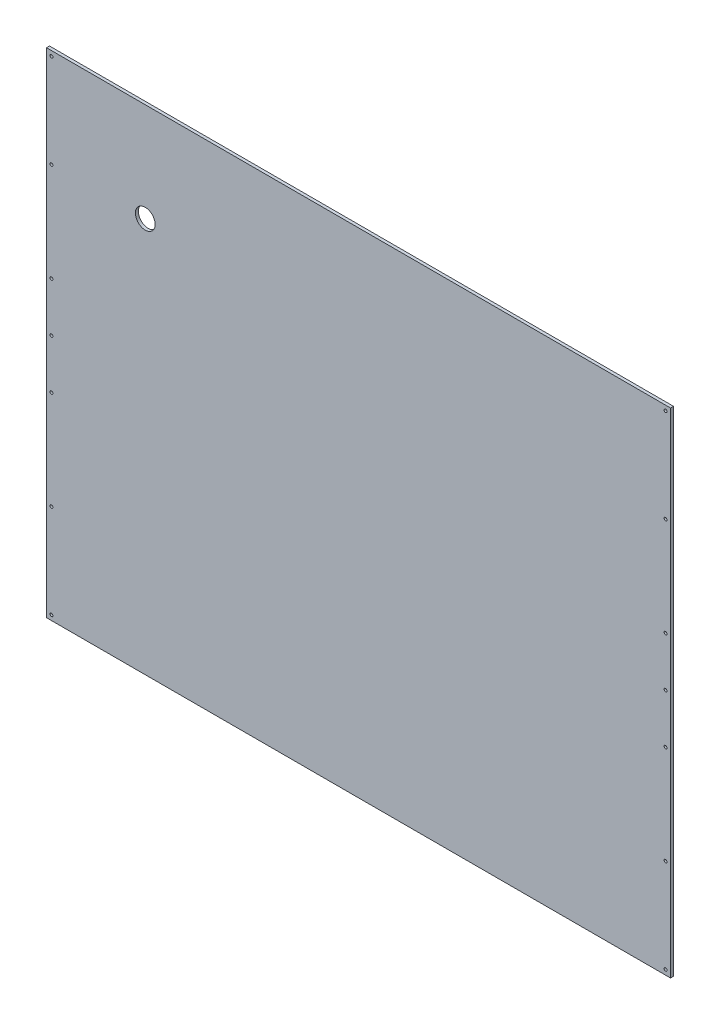
ISO-10303-21;
HEADER;
FILE_DESCRIPTION(('STEP AP214'),'2;1');
FILE_NAME('part.step','',(''),(''),'','','');
FILE_SCHEMA(('AUTOMOTIVE_DESIGN { 1 0 10303 214 1 1 1 1 }'));
ENDSEC;
DATA;
#1=APPLICATION_CONTEXT('core data for automotive mechanical design processes');
#2=APPLICATION_PROTOCOL_DEFINITION('international standard','automotive_design',2000,#1);
#3=PRODUCT_CONTEXT('',#1,'mechanical');
#4=PRODUCT('Part','Part','',(#3));
#5=PRODUCT_RELATED_PRODUCT_CATEGORY('part','',(#4));
#6=PRODUCT_DEFINITION_FORMATION('','',#4);
#7=PRODUCT_DEFINITION_CONTEXT('part definition',#1,'design');
#8=PRODUCT_DEFINITION('design','',#6,#7);
#9=PRODUCT_DEFINITION_SHAPE('','',#8);
#10=(LENGTH_UNIT() NAMED_UNIT(*) SI_UNIT(.MILLI.,.METRE.));
#11=(NAMED_UNIT(*) PLANE_ANGLE_UNIT() SI_UNIT($,.RADIAN.));
#12=(NAMED_UNIT(*) SI_UNIT($,.STERADIAN.) SOLID_ANGLE_UNIT());
#13=UNCERTAINTY_MEASURE_WITH_UNIT(LENGTH_MEASURE(1.E-05),#10,'distance_accuracy_value','');
#14=(GEOMETRIC_REPRESENTATION_CONTEXT(3) GLOBAL_UNCERTAINTY_ASSIGNED_CONTEXT((#13)) GLOBAL_UNIT_ASSIGNED_CONTEXT((#10,
#11,#12)) REPRESENTATION_CONTEXT('',''));
#15=CARTESIAN_POINT('',(0.,0.,0.));
#16=DIRECTION('',(0.,0.,1.));
#17=DIRECTION('',(1.,0.,0.));
#18=AXIS2_PLACEMENT_3D('',#15,#16,#17);
#19=CARTESIAN_POINT('',(0.,0.,3.));
#20=DIRECTION('',(0.,0.,-1.));
#21=DIRECTION('',(-1.,0.,0.));
#22=AXIS2_PLACEMENT_3D('',#19,#20,#21);
#23=PLANE('',#22);
#24=DIRECTION('',(0.,-1.,0.));
#25=VECTOR('',#24,1.);
#26=CARTESIAN_POINT('',(0.,0.,3.));
#27=LINE('',#26,#25);
#28=CARTESIAN_POINT('',(0.,500.,3.));
#29=VERTEX_POINT('',#28);
#30=CARTESIAN_POINT('',(0.,0.,3.));
#31=VERTEX_POINT('',#30);
#32=EDGE_CURVE('E87',#29,#31,#27,.T.);
#33=ORIENTED_EDGE('',*,*,#32,.T.);
#34=DIRECTION('',(1.,0.,0.));
#35=VECTOR('',#34,1.);
#36=CARTESIAN_POINT('',(0.,0.,3.));
#37=LINE('',#36,#35);
#38=CARTESIAN_POINT('',(632.,0.,3.));
#39=VERTEX_POINT('',#38);
#40=EDGE_CURVE('E82',#31,#39,#37,.T.);
#41=ORIENTED_EDGE('',*,*,#40,.T.);
#42=DIRECTION('',(0.,1.,0.));
#43=VECTOR('',#42,1.);
#44=CARTESIAN_POINT('',(632.,0.,3.));
#45=LINE('',#44,#43);
#46=CARTESIAN_POINT('',(632.,500.,3.));
#47=VERTEX_POINT('',#46);
#48=EDGE_CURVE('E85',#39,#47,#45,.T.);
#49=ORIENTED_EDGE('',*,*,#48,.T.);
#50=DIRECTION('',(-1.,0.,0.));
#51=VECTOR('',#50,1.);
#52=CARTESIAN_POINT('',(0.,500.,3.));
#53=LINE('',#52,#51);
#54=EDGE_CURVE('E52',#47,#29,#53,.T.);
#55=ORIENTED_EDGE('',*,*,#54,.T.);
#56=EDGE_LOOP('',(#33,#41,#49,#55));
#57=FACE_BOUND('',#56,.T.);
#58=CARTESIAN_POINT('',(627.,250.,3.));
#59=DIRECTION('',(0.,0.,1.));
#60=DIRECTION('',(1.,0.,0.));
#61=AXIS2_PLACEMENT_3D('',#58,#59,#60);
#62=CIRCLE('',#61,1.49999999999997);
#63=CARTESIAN_POINT('',(628.5,250.,3.));
#64=VERTEX_POINT('',#63);
#65=EDGE_CURVE('E102',#64,#64,#62,.T.);
#66=ORIENTED_EDGE('',*,*,#65,.F.);
#67=EDGE_LOOP('',(#66));
#68=FACE_BOUND('',#67,.T.);
#69=CARTESIAN_POINT('',(627.,300.,3.));
#70=DIRECTION('',(0.,0.,1.));
#71=DIRECTION('',(1.,0.,0.));
#72=AXIS2_PLACEMENT_3D('',#69,#70,#71);
#73=CIRCLE('',#72,1.49999999999997);
#74=CARTESIAN_POINT('',(628.5,300.,3.));
#75=VERTEX_POINT('',#74);
#76=EDGE_CURVE('E117',#75,#75,#73,.T.);
#77=ORIENTED_EDGE('',*,*,#76,.F.);
#78=EDGE_LOOP('',(#77));
#79=FACE_BOUND('',#78,.T.);
#80=CARTESIAN_POINT('',(627.,4.99999999999995,3.));
#81=DIRECTION('',(0.,0.,1.));
#82=DIRECTION('',(-1.,0.,0.));
#83=AXIS2_PLACEMENT_3D('',#80,#81,#82);
#84=CIRCLE('',#83,1.49999999999997);
#85=CARTESIAN_POINT('',(625.5,4.99999999999995,3.));
#86=VERTEX_POINT('',#85);
#87=EDGE_CURVE('E123',#86,#86,#84,.T.);
#88=ORIENTED_EDGE('',*,*,#87,.F.);
#89=EDGE_LOOP('',(#88));
#90=FACE_BOUND('',#89,.T.);
#91=CARTESIAN_POINT('',(627.,400.,3.));
#92=DIRECTION('',(0.,0.,1.));
#93=DIRECTION('',(1.,0.,0.));
#94=AXIS2_PLACEMENT_3D('',#91,#92,#93);
#95=CIRCLE('',#94,1.49999999999997);
#96=CARTESIAN_POINT('',(628.5,400.,3.));
#97=VERTEX_POINT('',#96);
#98=EDGE_CURVE('E129',#97,#97,#95,.T.);
#99=ORIENTED_EDGE('',*,*,#98,.F.);
#100=EDGE_LOOP('',(#99));
#101=FACE_BOUND('',#100,.T.);
#102=CARTESIAN_POINT('',(627.,99.9999999999999,3.));
#103=DIRECTION('',(0.,0.,1.));
#104=DIRECTION('',(-1.,0.,0.));
#105=AXIS2_PLACEMENT_3D('',#102,#103,#104);
#106=CIRCLE('',#105,1.49999999999997);
#107=CARTESIAN_POINT('',(625.5,99.9999999999999,3.));
#108=VERTEX_POINT('',#107);
#109=EDGE_CURVE('E135',#108,#108,#106,.T.);
#110=ORIENTED_EDGE('',*,*,#109,.F.);
#111=EDGE_LOOP('',(#110));
#112=FACE_BOUND('',#111,.T.);
#113=CARTESIAN_POINT('',(627.,495.,3.));
#114=DIRECTION('',(0.,0.,1.));
#115=DIRECTION('',(1.,0.,0.));
#116=AXIS2_PLACEMENT_3D('',#113,#114,#115);
#117=CIRCLE('',#116,1.49999999999997);
#118=CARTESIAN_POINT('',(628.5,495.,3.));
#119=VERTEX_POINT('',#118);
#120=EDGE_CURVE('E141',#119,#119,#117,.T.);
#121=ORIENTED_EDGE('',*,*,#120,.F.);
#122=EDGE_LOOP('',(#121));
#123=FACE_BOUND('',#122,.T.);
#124=CARTESIAN_POINT('',(627.,200.,3.));
#125=DIRECTION('',(0.,0.,1.));
#126=DIRECTION('',(-1.,0.,0.));
#127=AXIS2_PLACEMENT_3D('',#124,#125,#126);
#128=CIRCLE('',#127,1.49999999999997);
#129=CARTESIAN_POINT('',(625.5,200.,3.));
#130=VERTEX_POINT('',#129);
#131=EDGE_CURVE('E147',#130,#130,#128,.T.);
#132=ORIENTED_EDGE('',*,*,#131,.F.);
#133=EDGE_LOOP('',(#132));
#134=FACE_BOUND('',#133,.T.);
#135=CARTESIAN_POINT('',(5.,200.,3.));
#136=DIRECTION('',(0.,0.,1.));
#137=DIRECTION('',(1.,0.,0.));
#138=AXIS2_PLACEMENT_3D('',#135,#136,#137);
#139=CIRCLE('',#138,1.49999999999997);
#140=CARTESIAN_POINT('',(6.49999999999998,200.,3.));
#141=VERTEX_POINT('',#140);
#142=EDGE_CURVE('E153',#141,#141,#139,.T.);
#143=ORIENTED_EDGE('',*,*,#142,.F.);
#144=EDGE_LOOP('',(#143));
#145=FACE_BOUND('',#144,.T.);
#146=CARTESIAN_POINT('',(5.,99.9999999999999,3.));
#147=DIRECTION('',(0.,0.,1.));
#148=DIRECTION('',(1.,0.,0.));
#149=AXIS2_PLACEMENT_3D('',#146,#147,#148);
#150=CIRCLE('',#149,1.49999999999997);
#151=CARTESIAN_POINT('',(6.49999999999998,99.9999999999999,3.));
#152=VERTEX_POINT('',#151);
#153=EDGE_CURVE('E159',#152,#152,#150,.T.);
#154=ORIENTED_EDGE('',*,*,#153,.F.);
#155=EDGE_LOOP('',(#154));
#156=FACE_BOUND('',#155,.T.);
#157=CARTESIAN_POINT('',(4.99999999999989,4.99999999999995,3.));
#158=DIRECTION('',(0.,0.,1.));
#159=DIRECTION('',(1.,0.,0.));
#160=AXIS2_PLACEMENT_3D('',#157,#158,#159);
#161=CIRCLE('',#160,1.49999999999997);
#162=CARTESIAN_POINT('',(6.49999999999986,4.99999999999995,3.));
#163=VERTEX_POINT('',#162);
#164=EDGE_CURVE('E165',#163,#163,#161,.T.);
#165=ORIENTED_EDGE('',*,*,#164,.F.);
#166=EDGE_LOOP('',(#165));
#167=FACE_BOUND('',#166,.T.);
#168=CARTESIAN_POINT('',(5.,495.,3.));
#169=DIRECTION('',(0.,0.,1.));
#170=DIRECTION('',(-1.,0.,0.));
#171=AXIS2_PLACEMENT_3D('',#168,#169,#170);
#172=CIRCLE('',#171,1.49999999999997);
#173=CARTESIAN_POINT('',(3.50000000000003,495.,3.));
#174=VERTEX_POINT('',#173);
#175=EDGE_CURVE('E171',#174,#174,#172,.T.);
#176=ORIENTED_EDGE('',*,*,#175,.F.);
#177=EDGE_LOOP('',(#176));
#178=FACE_BOUND('',#177,.T.);
#179=CARTESIAN_POINT('',(5.,400.,3.));
#180=DIRECTION('',(0.,0.,1.));
#181=DIRECTION('',(-1.,0.,0.));
#182=AXIS2_PLACEMENT_3D('',#179,#180,#181);
#183=CIRCLE('',#182,1.49999999999997);
#184=CARTESIAN_POINT('',(3.50000000000003,400.,3.));
#185=VERTEX_POINT('',#184);
#186=EDGE_CURVE('E177',#185,#185,#183,.T.);
#187=ORIENTED_EDGE('',*,*,#186,.F.);
#188=EDGE_LOOP('',(#187));
#189=FACE_BOUND('',#188,.T.);
#190=CARTESIAN_POINT('',(5.,300.,3.));
#191=DIRECTION('',(0.,0.,1.));
#192=DIRECTION('',(-1.,0.,0.));
#193=AXIS2_PLACEMENT_3D('',#190,#191,#192);
#194=CIRCLE('',#193,1.49999999999997);
#195=CARTESIAN_POINT('',(3.50000000000003,300.,3.));
#196=VERTEX_POINT('',#195);
#197=EDGE_CURVE('E183',#196,#196,#194,.T.);
#198=ORIENTED_EDGE('',*,*,#197,.F.);
#199=EDGE_LOOP('',(#198));
#200=FACE_BOUND('',#199,.T.);
#201=CARTESIAN_POINT('',(5.,250.,3.));
#202=DIRECTION('',(0.,0.,1.));
#203=DIRECTION('',(-1.,0.,0.));
#204=AXIS2_PLACEMENT_3D('',#201,#202,#203);
#205=CIRCLE('',#204,1.49999999999997);
#206=CARTESIAN_POINT('',(3.50000000000003,250.,3.));
#207=VERTEX_POINT('',#206);
#208=EDGE_CURVE('E189',#207,#207,#205,.T.);
#209=ORIENTED_EDGE('',*,*,#208,.F.);
#210=EDGE_LOOP('',(#209));
#211=FACE_BOUND('',#210,.T.);
#212=CARTESIAN_POINT('',(100.,400.,3.));
#213=DIRECTION('',(0.,0.,1.));
#214=DIRECTION('',(1.,0.,0.));
#215=AXIS2_PLACEMENT_3D('',#212,#213,#214);
#216=CIRCLE('',#215,10.);
#217=CARTESIAN_POINT('',(110.,400.,3.));
#218=VERTEX_POINT('',#217);
#219=EDGE_CURVE('E195',#218,#218,#216,.T.);
#220=ORIENTED_EDGE('',*,*,#219,.F.);
#221=EDGE_LOOP('',(#220));
#222=FACE_BOUND('',#221,.T.);
#223=ADVANCED_FACE('F35',(#57,#68,#79,#90,#101,#112,#123,#134,#145,#156,#167,#178,#189,#200,
#211,#222),#23,.F.);
#224=CARTESIAN_POINT('',(0.,0.,0.));
#225=DIRECTION('',(0.,0.,-1.));
#226=DIRECTION('',(-1.,0.,0.));
#227=AXIS2_PLACEMENT_3D('',#224,#225,#226);
#228=PLANE('',#227);
#229=CARTESIAN_POINT('',(5.,250.,0.));
#230=DIRECTION('',(0.,0.,1.));
#231=DIRECTION('',(-1.,0.,0.));
#232=AXIS2_PLACEMENT_3D('',#229,#230,#231);
#233=CIRCLE('',#232,1.49999999999997);
#234=CARTESIAN_POINT('',(3.50000000000003,250.,0.));
#235=VERTEX_POINT('',#234);
#236=EDGE_CURVE('E192',#235,#235,#233,.T.);
#237=ORIENTED_EDGE('',*,*,#236,.T.);
#238=EDGE_LOOP('',(#237));
#239=FACE_BOUND('',#238,.T.);
#240=CARTESIAN_POINT('',(5.,400.,0.));
#241=DIRECTION('',(0.,0.,1.));
#242=DIRECTION('',(-1.,0.,0.));
#243=AXIS2_PLACEMENT_3D('',#240,#241,#242);
#244=CIRCLE('',#243,1.49999999999997);
#245=CARTESIAN_POINT('',(3.50000000000003,400.,0.));
#246=VERTEX_POINT('',#245);
#247=EDGE_CURVE('E180',#246,#246,#244,.T.);
#248=ORIENTED_EDGE('',*,*,#247,.T.);
#249=EDGE_LOOP('',(#248));
#250=FACE_BOUND('',#249,.T.);
#251=CARTESIAN_POINT('',(4.99999999999989,4.99999999999995,0.));
#252=DIRECTION('',(0.,0.,1.));
#253=DIRECTION('',(1.,0.,0.));
#254=AXIS2_PLACEMENT_3D('',#251,#252,#253);
#255=CIRCLE('',#254,1.49999999999997);
#256=CARTESIAN_POINT('',(6.49999999999986,4.99999999999995,0.));
#257=VERTEX_POINT('',#256);
#258=EDGE_CURVE('E168',#257,#257,#255,.T.);
#259=ORIENTED_EDGE('',*,*,#258,.T.);
#260=EDGE_LOOP('',(#259));
#261=FACE_BOUND('',#260,.T.);
#262=CARTESIAN_POINT('',(5.,200.,0.));
#263=DIRECTION('',(0.,0.,1.));
#264=DIRECTION('',(1.,0.,0.));
#265=AXIS2_PLACEMENT_3D('',#262,#263,#264);
#266=CIRCLE('',#265,1.49999999999997);
#267=CARTESIAN_POINT('',(6.49999999999998,200.,0.));
#268=VERTEX_POINT('',#267);
#269=EDGE_CURVE('E156',#268,#268,#266,.T.);
#270=ORIENTED_EDGE('',*,*,#269,.T.);
#271=EDGE_LOOP('',(#270));
#272=FACE_BOUND('',#271,.T.);
#273=CARTESIAN_POINT('',(627.,495.,0.));
#274=DIRECTION('',(0.,0.,1.));
#275=DIRECTION('',(1.,0.,0.));
#276=AXIS2_PLACEMENT_3D('',#273,#274,#275);
#277=CIRCLE('',#276,1.49999999999997);
#278=CARTESIAN_POINT('',(628.5,495.,0.));
#279=VERTEX_POINT('',#278);
#280=EDGE_CURVE('E144',#279,#279,#277,.T.);
#281=ORIENTED_EDGE('',*,*,#280,.T.);
#282=EDGE_LOOP('',(#281));
#283=FACE_BOUND('',#282,.T.);
#284=CARTESIAN_POINT('',(627.,400.,0.));
#285=DIRECTION('',(0.,0.,1.));
#286=DIRECTION('',(1.,0.,0.));
#287=AXIS2_PLACEMENT_3D('',#284,#285,#286);
#288=CIRCLE('',#287,1.49999999999997);
#289=CARTESIAN_POINT('',(628.5,400.,0.));
#290=VERTEX_POINT('',#289);
#291=EDGE_CURVE('E132',#290,#290,#288,.T.);
#292=ORIENTED_EDGE('',*,*,#291,.T.);
#293=EDGE_LOOP('',(#292));
#294=FACE_BOUND('',#293,.T.);
#295=CARTESIAN_POINT('',(627.,300.,0.));
#296=DIRECTION('',(0.,0.,1.));
#297=DIRECTION('',(1.,0.,0.));
#298=AXIS2_PLACEMENT_3D('',#295,#296,#297);
#299=CIRCLE('',#298,1.49999999999997);
#300=CARTESIAN_POINT('',(628.5,300.,0.));
#301=VERTEX_POINT('',#300);
#302=EDGE_CURVE('E120',#301,#301,#299,.T.);
#303=ORIENTED_EDGE('',*,*,#302,.T.);
#304=EDGE_LOOP('',(#303));
#305=FACE_BOUND('',#304,.T.);
#306=DIRECTION('',(0.,-1.,0.));
#307=VECTOR('',#306,1.);
#308=CARTESIAN_POINT('',(0.,0.,0.));
#309=LINE('',#308,#307);
#310=CARTESIAN_POINT('',(0.,500.,0.));
#311=VERTEX_POINT('',#310);
#312=CARTESIAN_POINT('',(0.,0.,0.));
#313=VERTEX_POINT('',#312);
#314=EDGE_CURVE('E99',#311,#313,#309,.T.);
#315=ORIENTED_EDGE('',*,*,#314,.F.);
#316=DIRECTION('',(-1.,0.,0.));
#317=VECTOR('',#316,1.);
#318=CARTESIAN_POINT('',(0.,500.,0.));
#319=LINE('',#318,#317);
#320=CARTESIAN_POINT('',(632.,500.,0.));
#321=VERTEX_POINT('',#320);
#322=EDGE_CURVE('E75',#321,#311,#319,.T.);
#323=ORIENTED_EDGE('',*,*,#322,.F.);
#324=DIRECTION('',(0.,1.,0.));
#325=VECTOR('',#324,1.);
#326=CARTESIAN_POINT('',(632.,0.,0.));
#327=LINE('',#326,#325);
#328=CARTESIAN_POINT('',(632.,0.,0.));
#329=VERTEX_POINT('',#328);
#330=EDGE_CURVE('E69',#329,#321,#327,.T.);
#331=ORIENTED_EDGE('',*,*,#330,.F.);
#332=DIRECTION('',(1.,0.,0.));
#333=VECTOR('',#332,1.);
#334=CARTESIAN_POINT('',(0.,0.,0.));
#335=LINE('',#334,#333);
#336=EDGE_CURVE('E91',#313,#329,#335,.T.);
#337=ORIENTED_EDGE('',*,*,#336,.F.);
#338=EDGE_LOOP('',(#315,#323,#331,#337));
#339=FACE_BOUND('',#338,.T.);
#340=CARTESIAN_POINT('',(627.,250.,0.));
#341=DIRECTION('',(0.,0.,1.));
#342=DIRECTION('',(1.,0.,0.));
#343=AXIS2_PLACEMENT_3D('',#340,#341,#342);
#344=CIRCLE('',#343,1.49999999999997);
#345=CARTESIAN_POINT('',(628.5,250.,0.));
#346=VERTEX_POINT('',#345);
#347=EDGE_CURVE('E114',#346,#346,#344,.T.);
#348=ORIENTED_EDGE('',*,*,#347,.T.);
#349=EDGE_LOOP('',(#348));
#350=FACE_BOUND('',#349,.T.);
#351=CARTESIAN_POINT('',(627.,4.99999999999995,0.));
#352=DIRECTION('',(0.,0.,1.));
#353=DIRECTION('',(-1.,0.,0.));
#354=AXIS2_PLACEMENT_3D('',#351,#352,#353);
#355=CIRCLE('',#354,1.49999999999997);
#356=CARTESIAN_POINT('',(625.5,4.99999999999995,0.));
#357=VERTEX_POINT('',#356);
#358=EDGE_CURVE('E126',#357,#357,#355,.T.);
#359=ORIENTED_EDGE('',*,*,#358,.T.);
#360=EDGE_LOOP('',(#359));
#361=FACE_BOUND('',#360,.T.);
#362=CARTESIAN_POINT('',(627.,99.9999999999999,0.));
#363=DIRECTION('',(0.,0.,1.));
#364=DIRECTION('',(-1.,0.,0.));
#365=AXIS2_PLACEMENT_3D('',#362,#363,#364);
#366=CIRCLE('',#365,1.49999999999997);
#367=CARTESIAN_POINT('',(625.5,99.9999999999999,0.));
#368=VERTEX_POINT('',#367);
#369=EDGE_CURVE('E138',#368,#368,#366,.T.);
#370=ORIENTED_EDGE('',*,*,#369,.T.);
#371=EDGE_LOOP('',(#370));
#372=FACE_BOUND('',#371,.T.);
#373=CARTESIAN_POINT('',(627.,200.,0.));
#374=DIRECTION('',(0.,0.,1.));
#375=DIRECTION('',(-1.,0.,0.));
#376=AXIS2_PLACEMENT_3D('',#373,#374,#375);
#377=CIRCLE('',#376,1.49999999999997);
#378=CARTESIAN_POINT('',(625.5,200.,0.));
#379=VERTEX_POINT('',#378);
#380=EDGE_CURVE('E150',#379,#379,#377,.T.);
#381=ORIENTED_EDGE('',*,*,#380,.T.);
#382=EDGE_LOOP('',(#381));
#383=FACE_BOUND('',#382,.T.);
#384=CARTESIAN_POINT('',(5.,99.9999999999999,0.));
#385=DIRECTION('',(0.,0.,1.));
#386=DIRECTION('',(1.,0.,0.));
#387=AXIS2_PLACEMENT_3D('',#384,#385,#386);
#388=CIRCLE('',#387,1.49999999999997);
#389=CARTESIAN_POINT('',(6.49999999999998,99.9999999999999,0.));
#390=VERTEX_POINT('',#389);
#391=EDGE_CURVE('E162',#390,#390,#388,.T.);
#392=ORIENTED_EDGE('',*,*,#391,.T.);
#393=EDGE_LOOP('',(#392));
#394=FACE_BOUND('',#393,.T.);
#395=CARTESIAN_POINT('',(5.,495.,0.));
#396=DIRECTION('',(0.,0.,1.));
#397=DIRECTION('',(-1.,0.,0.));
#398=AXIS2_PLACEMENT_3D('',#395,#396,#397);
#399=CIRCLE('',#398,1.49999999999997);
#400=CARTESIAN_POINT('',(3.50000000000003,495.,0.));
#401=VERTEX_POINT('',#400);
#402=EDGE_CURVE('E174',#401,#401,#399,.T.);
#403=ORIENTED_EDGE('',*,*,#402,.T.);
#404=EDGE_LOOP('',(#403));
#405=FACE_BOUND('',#404,.T.);
#406=CARTESIAN_POINT('',(5.,300.,0.));
#407=DIRECTION('',(0.,0.,1.));
#408=DIRECTION('',(-1.,0.,0.));
#409=AXIS2_PLACEMENT_3D('',#406,#407,#408);
#410=CIRCLE('',#409,1.49999999999997);
#411=CARTESIAN_POINT('',(3.50000000000003,300.,0.));
#412=VERTEX_POINT('',#411);
#413=EDGE_CURVE('E186',#412,#412,#410,.T.);
#414=ORIENTED_EDGE('',*,*,#413,.T.);
#415=EDGE_LOOP('',(#414));
#416=FACE_BOUND('',#415,.T.);
#417=CARTESIAN_POINT('',(100.,400.,0.));
#418=DIRECTION('',(0.,0.,1.));
#419=DIRECTION('',(1.,0.,0.));
#420=AXIS2_PLACEMENT_3D('',#417,#418,#419);
#421=CIRCLE('',#420,10.);
#422=CARTESIAN_POINT('',(110.,400.,0.));
#423=VERTEX_POINT('',#422);
#424=EDGE_CURVE('E198',#423,#423,#421,.T.);
#425=ORIENTED_EDGE('',*,*,#424,.T.);
#426=EDGE_LOOP('',(#425));
#427=FACE_BOUND('',#426,.T.);
#428=ADVANCED_FACE('F110',(#239,#250,#261,#272,#283,#294,#305,#339,#350,#361,#372,#383,#394,
#405,#416,#427),#228,.T.);
#429=CARTESIAN_POINT('',(0.,0.,3.));
#430=DIRECTION('',(1.,0.,0.));
#431=DIRECTION('',(0.,0.,-1.));
#432=AXIS2_PLACEMENT_3D('',#429,#430,#431);
#433=PLANE('',#432);
#434=ORIENTED_EDGE('',*,*,#314,.T.);
#435=DIRECTION('',(0.,0.,-1.));
#436=VECTOR('',#435,1.);
#437=CARTESIAN_POINT('',(0.,0.,3.));
#438=LINE('',#437,#436);
#439=EDGE_CURVE('E11',#31,#313,#438,.T.);
#440=ORIENTED_EDGE('',*,*,#439,.F.);
#441=ORIENTED_EDGE('',*,*,#32,.F.);
#442=DIRECTION('',(0.,0.,-1.));
#443=VECTOR('',#442,1.);
#444=CARTESIAN_POINT('',(0.,500.,3.));
#445=LINE('',#444,#443);
#446=EDGE_CURVE('E95',#29,#311,#445,.T.);
#447=ORIENTED_EDGE('',*,*,#446,.T.);
#448=EDGE_LOOP('',(#434,#440,#441,#447));
#449=FACE_BOUND('',#448,.T.);
#450=ADVANCED_FACE('F37',(#449),#433,.F.);
#451=CARTESIAN_POINT('',(0.,0.,3.));
#452=DIRECTION('',(0.,1.,0.));
#453=DIRECTION('',(0.,0.,1.));
#454=AXIS2_PLACEMENT_3D('',#451,#452,#453);
#455=PLANE('',#454);
#456=ORIENTED_EDGE('',*,*,#336,.T.);
#457=DIRECTION('',(0.,0.,-1.));
#458=VECTOR('',#457,1.);
#459=CARTESIAN_POINT('',(632.,0.,3.));
#460=LINE('',#459,#458);
#461=EDGE_CURVE('E44',#39,#329,#460,.T.);
#462=ORIENTED_EDGE('',*,*,#461,.F.);
#463=ORIENTED_EDGE('',*,*,#40,.F.);
#464=ORIENTED_EDGE('',*,*,#439,.T.);
#465=EDGE_LOOP('',(#456,#462,#463,#464));
#466=FACE_BOUND('',#465,.T.);
#467=ADVANCED_FACE('F90',(#466),#455,.F.);
#468=CARTESIAN_POINT('',(632.,0.,3.));
#469=DIRECTION('',(-1.,0.,0.));
#470=DIRECTION('',(0.,0.,1.));
#471=AXIS2_PLACEMENT_3D('',#468,#469,#470);
#472=PLANE('',#471);
#473=ORIENTED_EDGE('',*,*,#330,.T.);
#474=DIRECTION('',(0.,0.,-1.));
#475=VECTOR('',#474,1.);
#476=CARTESIAN_POINT('',(632.,500.,3.));
#477=LINE('',#476,#475);
#478=EDGE_CURVE('E92',#47,#321,#477,.T.);
#479=ORIENTED_EDGE('',*,*,#478,.F.);
#480=ORIENTED_EDGE('',*,*,#48,.F.);
#481=ORIENTED_EDGE('',*,*,#461,.T.);
#482=EDGE_LOOP('',(#473,#479,#480,#481));
#483=FACE_BOUND('',#482,.T.);
#484=ADVANCED_FACE('F93',(#483),#472,.F.);
#485=CARTESIAN_POINT('',(0.,500.,3.));
#486=DIRECTION('',(0.,-1.,0.));
#487=DIRECTION('',(0.,0.,-1.));
#488=AXIS2_PLACEMENT_3D('',#485,#486,#487);
#489=PLANE('',#488);
#490=ORIENTED_EDGE('',*,*,#322,.T.);
#491=ORIENTED_EDGE('',*,*,#446,.F.);
#492=ORIENTED_EDGE('',*,*,#54,.F.);
#493=ORIENTED_EDGE('',*,*,#478,.T.);
#494=EDGE_LOOP('',(#490,#491,#492,#493));
#495=FACE_BOUND('',#494,.T.);
#496=ADVANCED_FACE('F107',(#495),#489,.F.);
#497=CARTESIAN_POINT('',(627.,250.,3.));
#498=DIRECTION('',(0.,0.,-1.));
#499=DIRECTION('',(-1.,0.,0.));
#500=AXIS2_PLACEMENT_3D('',#497,#498,#499);
#501=CYLINDRICAL_SURFACE('',#500,1.49999999999997);
#502=ORIENTED_EDGE('',*,*,#65,.T.);
#503=EDGE_LOOP('',(#502));
#504=FACE_BOUND('',#503,.T.);
#505=ORIENTED_EDGE('',*,*,#347,.F.);
#506=EDGE_LOOP('',(#505));
#507=FACE_BOUND('',#506,.T.);
#508=ADVANCED_FACE('F215',(#504,#507),#501,.F.);
#509=CARTESIAN_POINT('',(627.,300.,3.));
#510=DIRECTION('',(0.,0.,-1.));
#511=DIRECTION('',(-1.,0.,0.));
#512=AXIS2_PLACEMENT_3D('',#509,#510,#511);
#513=CYLINDRICAL_SURFACE('',#512,1.49999999999997);
#514=ORIENTED_EDGE('',*,*,#76,.T.);
#515=EDGE_LOOP('',(#514));
#516=FACE_BOUND('',#515,.T.);
#517=ORIENTED_EDGE('',*,*,#302,.F.);
#518=EDGE_LOOP('',(#517));
#519=FACE_BOUND('',#518,.T.);
#520=ADVANCED_FACE('F261',(#516,#519),#513,.F.);
#521=CARTESIAN_POINT('',(627.,4.99999999999995,3.));
#522=DIRECTION('',(0.,0.,-1.));
#523=DIRECTION('',(-1.,0.,0.));
#524=AXIS2_PLACEMENT_3D('',#521,#522,#523);
#525=CYLINDRICAL_SURFACE('',#524,1.49999999999997);
#526=ORIENTED_EDGE('',*,*,#87,.T.);
#527=EDGE_LOOP('',(#526));
#528=FACE_BOUND('',#527,.T.);
#529=ORIENTED_EDGE('',*,*,#358,.F.);
#530=EDGE_LOOP('',(#529));
#531=FACE_BOUND('',#530,.T.);
#532=ADVANCED_FACE('F269',(#528,#531),#525,.F.);
#533=CARTESIAN_POINT('',(627.,400.,3.));
#534=DIRECTION('',(0.,0.,-1.));
#535=DIRECTION('',(-1.,0.,0.));
#536=AXIS2_PLACEMENT_3D('',#533,#534,#535);
#537=CYLINDRICAL_SURFACE('',#536,1.49999999999997);
#538=ORIENTED_EDGE('',*,*,#98,.T.);
#539=EDGE_LOOP('',(#538));
#540=FACE_BOUND('',#539,.T.);
#541=ORIENTED_EDGE('',*,*,#291,.F.);
#542=EDGE_LOOP('',(#541));
#543=FACE_BOUND('',#542,.T.);
#544=ADVANCED_FACE('F277',(#540,#543),#537,.F.);
#545=CARTESIAN_POINT('',(627.,99.9999999999999,3.));
#546=DIRECTION('',(0.,0.,-1.));
#547=DIRECTION('',(-1.,0.,0.));
#548=AXIS2_PLACEMENT_3D('',#545,#546,#547);
#549=CYLINDRICAL_SURFACE('',#548,1.49999999999997);
#550=ORIENTED_EDGE('',*,*,#109,.T.);
#551=EDGE_LOOP('',(#550));
#552=FACE_BOUND('',#551,.T.);
#553=ORIENTED_EDGE('',*,*,#369,.F.);
#554=EDGE_LOOP('',(#553));
#555=FACE_BOUND('',#554,.T.);
#556=ADVANCED_FACE('F286',(#552,#555),#549,.F.);
#557=CARTESIAN_POINT('',(627.,495.,3.));
#558=DIRECTION('',(0.,0.,-1.));
#559=DIRECTION('',(-1.,0.,0.));
#560=AXIS2_PLACEMENT_3D('',#557,#558,#559);
#561=CYLINDRICAL_SURFACE('',#560,1.49999999999997);
#562=ORIENTED_EDGE('',*,*,#120,.T.);
#563=EDGE_LOOP('',(#562));
#564=FACE_BOUND('',#563,.T.);
#565=ORIENTED_EDGE('',*,*,#280,.F.);
#566=EDGE_LOOP('',(#565));
#567=FACE_BOUND('',#566,.T.);
#568=ADVANCED_FACE('F295',(#564,#567),#561,.F.);
#569=CARTESIAN_POINT('',(627.,200.,3.));
#570=DIRECTION('',(0.,0.,-1.));
#571=DIRECTION('',(-1.,0.,0.));
#572=AXIS2_PLACEMENT_3D('',#569,#570,#571);
#573=CYLINDRICAL_SURFACE('',#572,1.49999999999997);
#574=ORIENTED_EDGE('',*,*,#131,.T.);
#575=EDGE_LOOP('',(#574));
#576=FACE_BOUND('',#575,.T.);
#577=ORIENTED_EDGE('',*,*,#380,.F.);
#578=EDGE_LOOP('',(#577));
#579=FACE_BOUND('',#578,.T.);
#580=ADVANCED_FACE('F304',(#576,#579),#573,.F.);
#581=CARTESIAN_POINT('',(5.,200.,3.));
#582=DIRECTION('',(0.,0.,-1.));
#583=DIRECTION('',(-1.,0.,0.));
#584=AXIS2_PLACEMENT_3D('',#581,#582,#583);
#585=CYLINDRICAL_SURFACE('',#584,1.49999999999997);
#586=ORIENTED_EDGE('',*,*,#142,.T.);
#587=EDGE_LOOP('',(#586));
#588=FACE_BOUND('',#587,.T.);
#589=ORIENTED_EDGE('',*,*,#269,.F.);
#590=EDGE_LOOP('',(#589));
#591=FACE_BOUND('',#590,.T.);
#592=ADVANCED_FACE('F313',(#588,#591),#585,.F.);
#593=CARTESIAN_POINT('',(5.,99.9999999999999,3.));
#594=DIRECTION('',(0.,0.,-1.));
#595=DIRECTION('',(-1.,0.,0.));
#596=AXIS2_PLACEMENT_3D('',#593,#594,#595);
#597=CYLINDRICAL_SURFACE('',#596,1.49999999999997);
#598=ORIENTED_EDGE('',*,*,#153,.T.);
#599=EDGE_LOOP('',(#598));
#600=FACE_BOUND('',#599,.T.);
#601=ORIENTED_EDGE('',*,*,#391,.F.);
#602=EDGE_LOOP('',(#601));
#603=FACE_BOUND('',#602,.T.);
#604=ADVANCED_FACE('F322',(#600,#603),#597,.F.);
#605=CARTESIAN_POINT('',(4.99999999999989,4.99999999999995,3.));
#606=DIRECTION('',(0.,0.,-1.));
#607=DIRECTION('',(-1.,0.,0.));
#608=AXIS2_PLACEMENT_3D('',#605,#606,#607);
#609=CYLINDRICAL_SURFACE('',#608,1.49999999999997);
#610=ORIENTED_EDGE('',*,*,#164,.T.);
#611=EDGE_LOOP('',(#610));
#612=FACE_BOUND('',#611,.T.);
#613=ORIENTED_EDGE('',*,*,#258,.F.);
#614=EDGE_LOOP('',(#613));
#615=FACE_BOUND('',#614,.T.);
#616=ADVANCED_FACE('F331',(#612,#615),#609,.F.);
#617=CARTESIAN_POINT('',(5.,495.,3.));
#618=DIRECTION('',(0.,0.,-1.));
#619=DIRECTION('',(-1.,0.,0.));
#620=AXIS2_PLACEMENT_3D('',#617,#618,#619);
#621=CYLINDRICAL_SURFACE('',#620,1.49999999999997);
#622=ORIENTED_EDGE('',*,*,#175,.T.);
#623=EDGE_LOOP('',(#622));
#624=FACE_BOUND('',#623,.T.);
#625=ORIENTED_EDGE('',*,*,#402,.F.);
#626=EDGE_LOOP('',(#625));
#627=FACE_BOUND('',#626,.T.);
#628=ADVANCED_FACE('F340',(#624,#627),#621,.F.);
#629=CARTESIAN_POINT('',(5.,400.,3.));
#630=DIRECTION('',(0.,0.,-1.));
#631=DIRECTION('',(-1.,0.,0.));
#632=AXIS2_PLACEMENT_3D('',#629,#630,#631);
#633=CYLINDRICAL_SURFACE('',#632,1.49999999999997);
#634=ORIENTED_EDGE('',*,*,#186,.T.);
#635=EDGE_LOOP('',(#634));
#636=FACE_BOUND('',#635,.T.);
#637=ORIENTED_EDGE('',*,*,#247,.F.);
#638=EDGE_LOOP('',(#637));
#639=FACE_BOUND('',#638,.T.);
#640=ADVANCED_FACE('F349',(#636,#639),#633,.F.);
#641=CARTESIAN_POINT('',(5.,300.,3.));
#642=DIRECTION('',(0.,0.,-1.));
#643=DIRECTION('',(-1.,0.,0.));
#644=AXIS2_PLACEMENT_3D('',#641,#642,#643);
#645=CYLINDRICAL_SURFACE('',#644,1.49999999999997);
#646=ORIENTED_EDGE('',*,*,#197,.T.);
#647=EDGE_LOOP('',(#646));
#648=FACE_BOUND('',#647,.T.);
#649=ORIENTED_EDGE('',*,*,#413,.F.);
#650=EDGE_LOOP('',(#649));
#651=FACE_BOUND('',#650,.T.);
#652=ADVANCED_FACE('F358',(#648,#651),#645,.F.);
#653=CARTESIAN_POINT('',(5.,250.,3.));
#654=DIRECTION('',(0.,0.,-1.));
#655=DIRECTION('',(-1.,0.,0.));
#656=AXIS2_PLACEMENT_3D('',#653,#654,#655);
#657=CYLINDRICAL_SURFACE('',#656,1.49999999999997);
#658=ORIENTED_EDGE('',*,*,#208,.T.);
#659=EDGE_LOOP('',(#658));
#660=FACE_BOUND('',#659,.T.);
#661=ORIENTED_EDGE('',*,*,#236,.F.);
#662=EDGE_LOOP('',(#661));
#663=FACE_BOUND('',#662,.T.);
#664=ADVANCED_FACE('F367',(#660,#663),#657,.F.);
#665=CARTESIAN_POINT('',(100.,400.,3.));
#666=DIRECTION('',(0.,0.,-1.));
#667=DIRECTION('',(-1.,0.,0.));
#668=AXIS2_PLACEMENT_3D('',#665,#666,#667);
#669=CYLINDRICAL_SURFACE('',#668,10.);
#670=ORIENTED_EDGE('',*,*,#219,.T.);
#671=EDGE_LOOP('',(#670));
#672=FACE_BOUND('',#671,.T.);
#673=ORIENTED_EDGE('',*,*,#424,.F.);
#674=EDGE_LOOP('',(#673));
#675=FACE_BOUND('',#674,.T.);
#676=ADVANCED_FACE('F204',(#672,#675),#669,.F.);
#677=CLOSED_SHELL('',(#223,#428,#450,#467,#484,#496,#508,#520,#532,#544,#556,#568,#580,#592,
#604,#616,#628,#640,#652,#664,#676));
#678=MANIFOLD_SOLID_BREP('B2',#677);
#679=ADVANCED_BREP_SHAPE_REPRESENTATION('',(#18,#678),#14);
#680=SHAPE_DEFINITION_REPRESENTATION(#9,#679);
ENDSEC;
END-ISO-10303-21;
